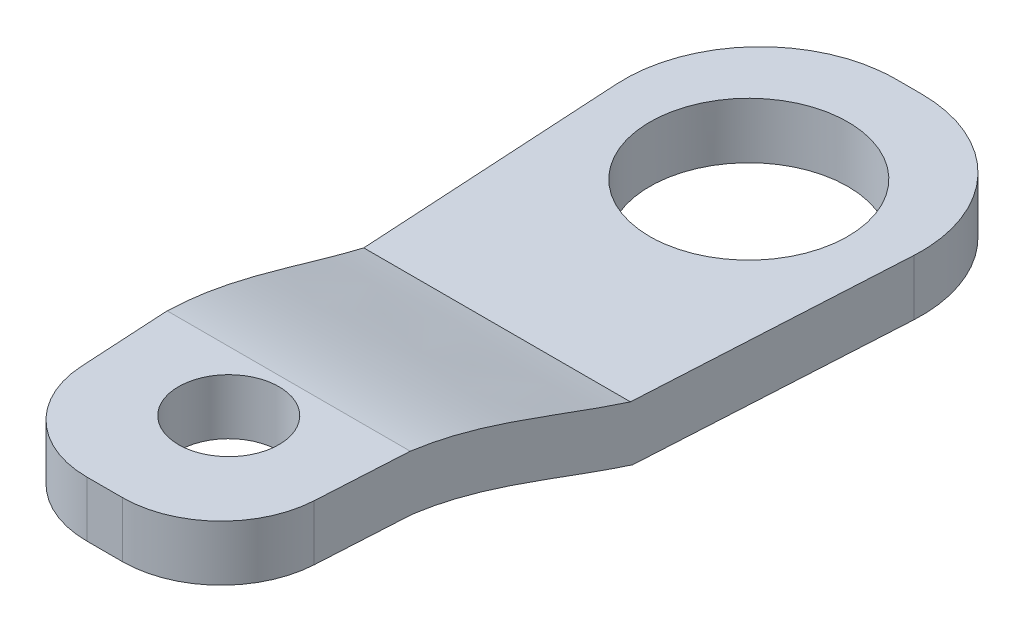
ISO-10303-21;
HEADER;
FILE_DESCRIPTION(('STEP AP214'),'2;1');
FILE_NAME('part.step','',(''),(''),'','','');
FILE_SCHEMA(('AUTOMOTIVE_DESIGN { 1 0 10303 214 1 1 1 1 }'));
ENDSEC;
DATA;
#1=APPLICATION_CONTEXT('core data for automotive mechanical design processes');
#2=APPLICATION_PROTOCOL_DEFINITION('international standard','automotive_design',2000,#1);
#3=PRODUCT_CONTEXT('',#1,'mechanical');
#4=PRODUCT('Part','Part','',(#3));
#5=PRODUCT_RELATED_PRODUCT_CATEGORY('part','',(#4));
#6=PRODUCT_DEFINITION_FORMATION('','',#4);
#7=PRODUCT_DEFINITION_CONTEXT('part definition',#1,'design');
#8=PRODUCT_DEFINITION('design','',#6,#7);
#9=PRODUCT_DEFINITION_SHAPE('','',#8);
#10=(LENGTH_UNIT() NAMED_UNIT(*) SI_UNIT(.MILLI.,.METRE.));
#11=(NAMED_UNIT(*) PLANE_ANGLE_UNIT() SI_UNIT($,.RADIAN.));
#12=(NAMED_UNIT(*) SI_UNIT($,.STERADIAN.) SOLID_ANGLE_UNIT());
#13=UNCERTAINTY_MEASURE_WITH_UNIT(LENGTH_MEASURE(1.E-05),#10,'distance_accuracy_value','');
#14=(GEOMETRIC_REPRESENTATION_CONTEXT(3) GLOBAL_UNCERTAINTY_ASSIGNED_CONTEXT((#13)) GLOBAL_UNIT_ASSIGNED_CONTEXT((#10,
#11,#12)) REPRESENTATION_CONTEXT('',''));
#15=CARTESIAN_POINT('',(0.,0.,0.));
#16=DIRECTION('',(0.,0.,1.));
#17=DIRECTION('',(1.,0.,0.));
#18=AXIS2_PLACEMENT_3D('',#15,#16,#17);
#19=CARTESIAN_POINT('',(-0.780669662808267,9.,-8.15169029207018));
#20=DIRECTION('',(0.,-1.,0.));
#21=DIRECTION('',(0.,0.,-1.));
#22=AXIS2_PLACEMENT_3D('',#19,#20,#21);
#23=CYLINDRICAL_SURFACE('',#22,8.);
#24=CARTESIAN_POINT('',(-0.780669662808267,8.99486053534029,-8.15169029207018));
#25=DIRECTION('',(0.,1.,0.));
#26=DIRECTION('',(0.,0.,1.));
#27=AXIS2_PLACEMENT_3D('',#24,#25,#26);
#28=CIRCLE('',#27,8.);
#29=CARTESIAN_POINT('',(-0.780669662808324,8.99486053534029,-0.151690292070181));
#30=VERTEX_POINT('',#29);
#31=CARTESIAN_POINT('',(7.20652224520296,8.99486053534029,-7.69918015450417));
#32=VERTEX_POINT('',#31);
#33=EDGE_CURVE('E147',#30,#32,#28,.T.);
#34=ORIENTED_EDGE('',*,*,#33,.F.);
#35=DIRECTION('',(0.,-1.,0.));
#36=VECTOR('',#35,1.);
#37=CARTESIAN_POINT('',(-0.780669662808324,9.,-0.151690292070182));
#38=LINE('',#37,#36);
#39=CARTESIAN_POINT('',(-0.780669662808324,4.5,-0.151690292070182));
#40=VERTEX_POINT('',#39);
#41=EDGE_CURVE('E61',#30,#40,#38,.T.);
#42=ORIENTED_EDGE('',*,*,#41,.T.);
#43=CARTESIAN_POINT('',(-0.780669662808267,4.5,-8.15169029207018));
#44=DIRECTION('',(0.,1.,0.));
#45=DIRECTION('',(0.,0.,1.));
#46=AXIS2_PLACEMENT_3D('',#43,#44,#45);
#47=CIRCLE('',#46,8.);
#48=CARTESIAN_POINT('',(7.20652224520296,4.5,-7.69918015450417));
#49=VERTEX_POINT('',#48);
#50=EDGE_CURVE('E229',#40,#49,#47,.T.);
#51=ORIENTED_EDGE('',*,*,#50,.T.);
#52=DIRECTION('',(0.,-1.,0.));
#53=VECTOR('',#52,1.);
#54=CARTESIAN_POINT('',(7.20652224520296,9.,-7.69918015450417));
#55=LINE('',#54,#53);
#56=EDGE_CURVE('E258',#32,#49,#55,.T.);
#57=ORIENTED_EDGE('',*,*,#56,.F.);
#58=EDGE_LOOP('',(#34,#42,#51,#57));
#59=FACE_BOUND('',#58,.T.);
#60=ADVANCED_FACE('F34',(#59),#23,.T.);
#61=CARTESIAN_POINT('',(-3.66148394776118,9.,-8.15169029207018));
#62=DIRECTION('',(0.,-1.,0.));
#63=DIRECTION('',(0.,0.,-1.));
#64=AXIS2_PLACEMENT_3D('',#61,#62,#63);
#65=CYLINDRICAL_SURFACE('',#64,8.);
#66=CARTESIAN_POINT('',(-3.66148394776118,8.99486053534029,-8.15169029207018));
#67=DIRECTION('',(0.,1.,0.));
#68=DIRECTION('',(0.,0.,1.));
#69=AXIS2_PLACEMENT_3D('',#66,#67,#68);
#70=CIRCLE('',#69,8.);
#71=CARTESIAN_POINT('',(-11.6486758557724,8.99486053534029,-7.69918015450416));
#72=VERTEX_POINT('',#71);
#73=CARTESIAN_POINT('',(-3.66148394776113,8.99486053534029,-0.151690292070181));
#74=VERTEX_POINT('',#73);
#75=EDGE_CURVE('E53',#72,#74,#70,.T.);
#76=ORIENTED_EDGE('',*,*,#75,.F.);
#77=DIRECTION('',(0.,-1.,0.));
#78=VECTOR('',#77,1.);
#79=CARTESIAN_POINT('',(-11.6486758557724,9.,-7.69918015450416));
#80=LINE('',#79,#78);
#81=CARTESIAN_POINT('',(-11.6486758557724,4.5,-7.69918015450416));
#82=VERTEX_POINT('',#81);
#83=EDGE_CURVE('E146',#72,#82,#80,.T.);
#84=ORIENTED_EDGE('',*,*,#83,.T.);
#85=CARTESIAN_POINT('',(-3.66148394776118,4.5,-8.15169029207018));
#86=DIRECTION('',(0.,1.,0.));
#87=DIRECTION('',(0.,0.,1.));
#88=AXIS2_PLACEMENT_3D('',#85,#86,#87);
#89=CIRCLE('',#88,8.);
#90=CARTESIAN_POINT('',(-3.66148394776113,4.5,-0.151690292070182));
#91=VERTEX_POINT('',#90);
#92=EDGE_CURVE('E262',#82,#91,#89,.T.);
#93=ORIENTED_EDGE('',*,*,#92,.T.);
#94=DIRECTION('',(0.,-1.,0.));
#95=VECTOR('',#94,1.);
#96=CARTESIAN_POINT('',(-3.66148394776113,9.,-0.151690292070181));
#97=LINE('',#96,#95);
#98=EDGE_CURVE('E247',#74,#91,#97,.T.);
#99=ORIENTED_EDGE('',*,*,#98,.F.);
#100=EDGE_LOOP('',(#76,#84,#93,#99));
#101=FACE_BOUND('',#100,.T.);
#102=ADVANCED_FACE('F290',(#101),#65,.T.);
#103=CARTESIAN_POINT('',(-2.22107680528473,9.,-0.151690292070181));
#104=DIRECTION('',(0.,0.,-1.));
#105=DIRECTION('',(-1.,0.,0.));
#106=AXIS2_PLACEMENT_3D('',#103,#104,#105);
#107=PLANE('',#106);
#108=DIRECTION('',(1.,0.,0.));
#109=VECTOR('',#108,1.);
#110=CARTESIAN_POINT('',(-2.22107680528473,8.99486053534029,-0.151690292070181));
#111=LINE('',#110,#109);
#112=EDGE_CURVE('E150',#74,#30,#111,.T.);
#113=ORIENTED_EDGE('',*,*,#112,.F.);
#114=ORIENTED_EDGE('',*,*,#98,.T.);
#115=DIRECTION('',(-1.,0.,0.));
#116=VECTOR('',#115,1.);
#117=CARTESIAN_POINT('',(80.,4.5,-0.151690292070182));
#118=LINE('',#117,#116);
#119=EDGE_CURVE('E270',#40,#91,#118,.T.);
#120=ORIENTED_EDGE('',*,*,#119,.F.);
#121=ORIENTED_EDGE('',*,*,#41,.F.);
#122=EDGE_LOOP('',(#113,#114,#120,#121));
#123=FACE_BOUND('',#122,.T.);
#124=ADVANCED_FACE('F287',(#123),#107,.F.);
#125=CARTESIAN_POINT('',(-2.22107680528473,9.,-10.2016864688228));
#126=DIRECTION('',(0.,-1.,0.));
#127=DIRECTION('',(0.,0.,-1.));
#128=AXIS2_PLACEMENT_3D('',#125,#126,#127);
#129=CYLINDRICAL_SURFACE('',#128,4.06906829041187);
#130=CARTESIAN_POINT('',(-2.22107680528473,4.5,-10.2016864688228));
#131=DIRECTION('',(0.,1.,0.));
#132=DIRECTION('',(0.,0.,1.));
#133=AXIS2_PLACEMENT_3D('',#130,#131,#132);
#134=CIRCLE('',#133,4.06906829041187);
#135=CARTESIAN_POINT('',(-2.22107680528473,4.5,-6.13261817841093));
#136=VERTEX_POINT('',#135);
#137=EDGE_CURVE('E260',#136,#136,#134,.T.);
#138=ORIENTED_EDGE('',*,*,#137,.F.);
#139=EDGE_LOOP('',(#138));
#140=FACE_BOUND('',#139,.T.);
#141=CARTESIAN_POINT('',(-2.22107680528473,8.99486053534029,-10.2016864688228));
#142=DIRECTION('',(0.,1.,0.));
#143=DIRECTION('',(0.,0.,1.));
#144=AXIS2_PLACEMENT_3D('',#141,#142,#143);
#145=CIRCLE('',#144,4.06906829041187);
#146=CARTESIAN_POINT('',(-2.22107680528473,8.99486053534029,-6.13261817841093));
#147=VERTEX_POINT('',#146);
#148=EDGE_CURVE('E197',#147,#147,#145,.T.);
#149=ORIENTED_EDGE('',*,*,#148,.T.);
#150=EDGE_LOOP('',(#149));
#151=FACE_BOUND('',#150,.T.);
#152=ADVANCED_FACE('F326',(#140,#151),#129,.F.);
#153=CARTESIAN_POINT('',(-0.780669662808267,0.,-8.15169029207018));
#154=DIRECTION('',(0.,1.,0.));
#155=DIRECTION('',(0.,0.,1.));
#156=AXIS2_PLACEMENT_3D('',#153,#154,#155);
#157=PLANE('',#156);
#158=CARTESIAN_POINT('',(-2.22107680528473,0.,-52.323354079952));
#159=DIRECTION('',(0.,1.,0.));
#160=DIRECTION('',(0.,0.,1.));
#161=AXIS2_PLACEMENT_3D('',#158,#159,#160);
#162=CIRCLE('',#161,8.02268496328231);
#163=CARTESIAN_POINT('',(-2.22107680528473,0.,-44.3006691166697));
#164=VERTEX_POINT('',#163);
#165=EDGE_CURVE('E220',#164,#164,#162,.T.);
#166=ORIENTED_EDGE('',*,*,#165,.T.);
#167=EDGE_LOOP('',(#166));
#168=FACE_BOUND('',#167,.T.);
#169=DIRECTION('',(0.0565637671957587,0.,-0.998398988501403));
#170=VECTOR('',#169,1.);
#171=CARTESIAN_POINT('',(9.81047351269663,0.,-53.6611526407986));
#172=LINE('',#171,#170);
#173=CARTESIAN_POINT('',(8.58959736948983,0.,-32.1116419399878));
#174=VERTEX_POINT('',#173);
#175=CARTESIAN_POINT('',(9.81047351269663,0.,-53.6611526407986));
#176=VERTEX_POINT('',#175);
#177=EDGE_CURVE('E222',#174,#176,#172,.T.);
#178=ORIENTED_EDGE('',*,*,#177,.F.);
#179=DIRECTION('',(-1.,0.,0.));
#180=VECTOR('',#179,1.);
#181=CARTESIAN_POINT('',(80.,0.,-32.1116419399878));
#182=LINE('',#181,#180);
#183=CARTESIAN_POINT('',(-13.0317509800593,0.,-32.1116419399878));
#184=VERTEX_POINT('',#183);
#185=EDGE_CURVE('E174',#174,#184,#182,.T.);
#186=ORIENTED_EDGE('',*,*,#185,.T.);
#187=DIRECTION('',(0.0565637671957587,0.,0.998398988501403));
#188=VECTOR('',#187,1.);
#189=CARTESIAN_POINT('',(-11.6486758557724,0.,-7.69918015450416));
#190=LINE('',#189,#188);
#191=CARTESIAN_POINT('',(-14.2526271232661,0.,-53.6611526407986));
#192=VERTEX_POINT('',#191);
#193=EDGE_CURVE('E244',#192,#184,#190,.T.);
#194=ORIENTED_EDGE('',*,*,#193,.F.);
#195=CARTESIAN_POINT('',(-3.27023824975065,0.,-54.283354079952));
#196=DIRECTION('',(0.,1.,0.));
#197=DIRECTION('',(0.,0.,1.));
#198=AXIS2_PLACEMENT_3D('',#195,#196,#197);
#199=CIRCLE('',#198,11.);
#200=CARTESIAN_POINT('',(-3.27023824975057,0.,-65.283354079952));
#201=VERTEX_POINT('',#200);
#202=EDGE_CURVE('E241',#201,#192,#199,.T.);
#203=ORIENTED_EDGE('',*,*,#202,.F.);
#204=DIRECTION('',(-1.,0.,0.));
#205=VECTOR('',#204,1.);
#206=CARTESIAN_POINT('',(-2.22107680528473,0.,-65.283354079952));
#207=LINE('',#206,#205);
#208=CARTESIAN_POINT('',(-1.17191536081888,0.,-65.283354079952));
#209=VERTEX_POINT('',#208);
#210=EDGE_CURVE('E238',#209,#201,#207,.T.);
#211=ORIENTED_EDGE('',*,*,#210,.F.);
#212=CARTESIAN_POINT('',(-1.1719153608188,0.,-54.283354079952));
#213=DIRECTION('',(0.,1.,0.));
#214=DIRECTION('',(0.,0.,-1.));
#215=AXIS2_PLACEMENT_3D('',#212,#213,#214);
#216=CIRCLE('',#215,11.);
#217=EDGE_CURVE('E226',#176,#209,#216,.T.);
#218=ORIENTED_EDGE('',*,*,#217,.F.);
#219=EDGE_LOOP('',(#178,#186,#194,#203,#211,#218));
#220=FACE_BOUND('',#219,.T.);
#221=ADVANCED_FACE('F295',(#168,#220),#157,.F.);
#222=CARTESIAN_POINT('',(9.81047351269663,9.,-53.6611526407986));
#223=DIRECTION('',(-0.998398988501403,0.,-0.0565637671957587));
#224=DIRECTION('',(-0.0565637671957587,0.,0.998398988501403));
#225=AXIS2_PLACEMENT_3D('',#222,#223,#224);
#226=PLANE('',#225);
#227=DIRECTION('',(0.,-1.,0.));
#228=VECTOR('',#227,1.);
#229=CARTESIAN_POINT('',(9.81047351269663,9.,-53.6611526407986));
#230=LINE('',#229,#228);
#231=CARTESIAN_POINT('',(9.81047351269663,4.52006155844422,-53.6611526407986));
#232=VERTEX_POINT('',#231);
#233=EDGE_CURVE('E256',#232,#176,#230,.T.);
#234=ORIENTED_EDGE('',*,*,#233,.F.);
#235=DIRECTION('',(-0.0565637292559566,-0.00115822595482634,0.998398318831365));
#236=VECTOR('',#235,1.);
#237=CARTESIAN_POINT('',(9.8107670094991,4.52006756822503,-53.6663331110048));
#238=LINE('',#237,#236);
#239=CARTESIAN_POINT('',(8.5797431514192,4.49486053534028,-31.9377065420833));
#240=VERTEX_POINT('',#239);
#241=EDGE_CURVE('E166',#232,#240,#238,.T.);
#242=ORIENTED_EDGE('',*,*,#241,.T.);
#243=CARTESIAN_POINT('',(8.5797431514192,4.49486053534028,-31.9377065420833));
#244=CARTESIAN_POINT('',(8.55914582804003,4.5970792493573,-31.5741461243969));
#245=CARTESIAN_POINT('',(8.53860465611112,4.70273620031739,-31.2115768279517));
#246=CARTESIAN_POINT('',(8.4976154109246,4.91939420509451,-30.488081506432));
#247=CARTESIAN_POINT('',(8.4771673257264,5.03039455106912,-30.127155270596));
#248=CARTESIAN_POINT('',(8.43632906249029,5.25629317982073,-29.4063249099523));
#249=CARTESIAN_POINT('',(8.41593891986661,5.37119344867318,-29.0464214102361));
#250=CARTESIAN_POINT('',(8.37520152584483,5.60339617018415,-28.3273714777102));
#251=CARTESIAN_POINT('',(8.3548542764915,5.72069873462851,-27.9682250809922));
#252=CARTESIAN_POINT('',(8.29385359984087,6.07399769397459,-26.8915108364279));
#253=CARTESIAN_POINT('',(8.25322761540412,6.31146283493225,-26.1744273785997));
#254=CARTESIAN_POINT('',(8.17186878695472,6.77905526179066,-24.7383742998077));
#255=CARTESIAN_POINT('',(8.13113603335511,7.00918738267715,-24.0194062747117));
#256=CARTESIAN_POINT('',(8.05223783504586,7.43536932076373,-22.6267854276256));
#257=CARTESIAN_POINT('',(8.01409454023009,7.63267847087418,-21.9535235702535));
#258=CARTESIAN_POINT('',(7.93742760401336,8.00167008405338,-20.6002864121737));
#259=CARTESIAN_POINT('',(7.89890416086955,8.17336522287887,-19.9203146108743));
#260=CARTESIAN_POINT('',(7.82119126055154,8.48179473238248,-18.5486152896024));
#261=CARTESIAN_POINT('',(7.78199941121125,8.61834667443748,-17.856845545847));
#262=CARTESIAN_POINT('',(7.72284906640709,8.78798884970072,-16.8127912448384));
#263=CARTESIAN_POINT('',(7.70305157922208,8.83870549613929,-16.4633486217547));
#264=CARTESIAN_POINT('',(7.66335650266666,8.92699148907899,-15.7626964861878));
#265=CARTESIAN_POINT('',(7.64345888087175,8.96455625623969,-15.4114864013843));
#266=CARTESIAN_POINT('',(7.62352199629893,8.99486053534029,-15.0595832948872));
#267=B_SPLINE_CURVE_WITH_KNOTS('',3,(#243,#244,#245,#246,#247,#248,#249,#250,#251,#252,#253,
#254,#255,#256,#257,#258,#259,#260,#261,#262,#263,#264,#265,#266),.UNSPECIFIED.,.F.,.F.,(4,2,2,
2,2,2,2,2,2,2,2,4),(0.,1.13460032678775,2.26905076385937,3.40408786512976,4.53917790354189,
6.80859872393722,9.07649087757242,11.1840030176922,13.2904687162311,15.4076580477269,
16.4684080106242,17.5295269485927),.UNSPECIFIED.);
#268=CARTESIAN_POINT('',(7.62352199629893,8.99486053534029,-15.0595832948872));
#269=VERTEX_POINT('',#268);
#270=EDGE_CURVE('E169',#240,#269,#267,.T.);
#271=ORIENTED_EDGE('',*,*,#270,.T.);
#272=DIRECTION('',(0.0565637671957587,0.,-0.998398988501403));
#273=VECTOR('',#272,1.);
#274=CARTESIAN_POINT('',(9.81047351269663,8.99486053534029,-53.6611526407986));
#275=LINE('',#274,#273);
#276=EDGE_CURVE('E141',#32,#269,#275,.T.);
#277=ORIENTED_EDGE('',*,*,#276,.F.);
#278=ORIENTED_EDGE('',*,*,#56,.T.);
#279=DIRECTION('',(0.0565637671957587,0.,-0.998398988501403));
#280=VECTOR('',#279,1.);
#281=CARTESIAN_POINT('',(9.81047351269663,4.5,-53.6611526407986));
#282=LINE('',#281,#280);
#283=CARTESIAN_POINT('',(7.63337621436956,4.5,-15.2335186927917));
#284=VERTEX_POINT('',#283);
#285=EDGE_CURVE('E279',#49,#284,#282,.T.);
#286=ORIENTED_EDGE('',*,*,#285,.T.);
#287=CARTESIAN_POINT('',(7.63337621436956,4.5,-15.2335186927917));
#288=CARTESIAN_POINT('',(7.65481178011339,4.46741998713298,-15.6118748069193));
#289=CARTESIAN_POINT('',(7.67620144314196,4.42644478542694,-15.9894206987656));
#290=CARTESIAN_POINT('',(7.71886237435082,4.3294067006668,-16.7424227118751));
#291=CARTESIAN_POINT('',(7.74013368896052,4.27335023351986,-17.1178796526569));
#292=CARTESIAN_POINT('',(7.80361099923428,4.08549115965417,-18.2383086041228));
#293=CARTESIAN_POINT('',(7.84562862571069,3.93375031413076,-18.9799557371375));
#294=CARTESIAN_POINT('',(7.92905377560243,3.59077761267957,-20.4524811610406));
#295=CARTESIAN_POINT('',(7.97046218389027,3.39961070283325,-21.1833750706874));
#296=CARTESIAN_POINT('',(8.05291242146074,2.9899238334399,-22.6386924562355));
#297=CARTESIAN_POINT('',(8.09395350415737,2.77135772992274,-23.3631027542536));
#298=CARTESIAN_POINT('',(8.17286844851725,2.33494634432919,-24.7560191834912));
#299=CARTESIAN_POINT('',(8.21076109700417,2.11814251204988,-25.4248569182562));
#300=CARTESIAN_POINT('',(8.28646895140348,1.68037546936244,-26.7611654599466));
#301=CARTESIAN_POINT('',(8.32428415622677,1.45941220089916,-27.4286362476486));
#302=CARTESIAN_POINT('',(8.3998564324967,1.02313584923814,-28.7625517191116));
#303=CARTESIAN_POINT('',(8.43761314999666,0.807804000470039,-29.42899015541));
#304=CARTESIAN_POINT('',(8.49443646733797,0.495239594533197,-30.4319704265174));
#305=CARTESIAN_POINT('',(8.51341043961417,0.392782740251991,-30.7668773053829));
#306=CARTESIAN_POINT('',(8.55143933137511,0.192562864053536,-31.4381198507486));
#307=CARTESIAN_POINT('',(8.5704942587001,0.0948003085897183,-31.774455655636));
#308=CARTESIAN_POINT('',(8.58959736948981,0.,-32.1116419399878));
#309=B_SPLINE_CURVE_WITH_KNOTS('',3,(#287,#288,#289,#290,#291,#292,#293,#294,#295,#296,#297,
#298,#299,#300,#301,#302,#303,#304,#305,#306,#307,#308),.UNSPECIFIED.,.F.,.F.,(4,2,2,2,2,2,2,2,
2,2,4),(0.,1.14085007601867,2.28121557430259,4.55406829795096,6.82320646241391,9.09621883997866,
11.2085359152778,13.3208824950448,15.4249420681175,16.47713663533,17.5294355394026),.UNSPECIFIED.);
#310=EDGE_CURVE('E223',#284,#174,#309,.T.);
#311=ORIENTED_EDGE('',*,*,#310,.T.);
#312=ORIENTED_EDGE('',*,*,#177,.T.);
#313=EDGE_LOOP('',(#234,#242,#271,#277,#278,#286,#311,#312));
#314=FACE_BOUND('',#313,.T.);
#315=ADVANCED_FACE('F179',(#314),#226,.F.);
#316=CARTESIAN_POINT('',(-1.1719153608188,9.,-54.283354079952));
#317=DIRECTION('',(0.,-1.,0.));
#318=DIRECTION('',(0.,0.,-1.));
#319=AXIS2_PLACEMENT_3D('',#316,#317,#318);
#320=CYLINDRICAL_SURFACE('',#319,11.);
#321=DIRECTION('',(0.,-1.,0.));
#322=VECTOR('',#321,1.);
#323=CARTESIAN_POINT('',(-1.17191536081888,9.,-65.283354079952));
#324=LINE('',#323,#322);
#325=CARTESIAN_POINT('',(-1.17191536081888,4.53354428883864,-65.283354079952));
#326=VERTEX_POINT('',#325);
#327=EDGE_CURVE('E254',#326,#209,#324,.T.);
#328=ORIENTED_EDGE('',*,*,#327,.F.);
#329=CARTESIAN_POINT('',(-1.1719153608188,4.52078336440319,-54.283354079952));
#330=DIRECTION('',(0.,-0.99999932710319,-0.00116008325896973));
#331=DIRECTION('',(0.,-0.00116008325896973,0.99999932710319));
#332=AXIS2_PLACEMENT_3D('',#329,#330,#331);
#333=ELLIPSE('',#332,11.0000074018699,11.);
#334=EDGE_CURVE('E163',#326,#232,#333,.T.);
#335=ORIENTED_EDGE('',*,*,#334,.T.);
#336=ORIENTED_EDGE('',*,*,#233,.T.);
#337=ORIENTED_EDGE('',*,*,#217,.T.);
#338=EDGE_LOOP('',(#328,#335,#336,#337));
#339=FACE_BOUND('',#338,.T.);
#340=ADVANCED_FACE('F309',(#339),#320,.T.);
#341=CARTESIAN_POINT('',(-2.22107680528473,9.,-65.283354079952));
#342=DIRECTION('',(0.,0.,1.));
#343=DIRECTION('',(1.,0.,0.));
#344=AXIS2_PLACEMENT_3D('',#341,#342,#343);
#345=PLANE('',#344);
#346=DIRECTION('',(0.,-1.,0.));
#347=VECTOR('',#346,1.);
#348=CARTESIAN_POINT('',(-3.27023824975057,9.,-65.283354079952));
#349=LINE('',#348,#347);
#350=CARTESIAN_POINT('',(-3.27023824975057,4.53354428883864,-65.283354079952));
#351=VERTEX_POINT('',#350);
#352=EDGE_CURVE('E252',#351,#201,#349,.T.);
#353=ORIENTED_EDGE('',*,*,#352,.F.);
#354=DIRECTION('',(1.,0.,0.));
#355=VECTOR('',#354,1.);
#356=CARTESIAN_POINT('',(-2.22107680528473,4.53354428883864,-65.283354079952));
#357=LINE('',#356,#355);
#358=EDGE_CURVE('E160',#351,#326,#357,.T.);
#359=ORIENTED_EDGE('',*,*,#358,.T.);
#360=ORIENTED_EDGE('',*,*,#327,.T.);
#361=ORIENTED_EDGE('',*,*,#210,.T.);
#362=EDGE_LOOP('',(#353,#359,#360,#361));
#363=FACE_BOUND('',#362,.T.);
#364=ADVANCED_FACE('F310',(#363),#345,.F.);
#365=CARTESIAN_POINT('',(-3.27023824975065,9.,-54.283354079952));
#366=DIRECTION('',(0.,-1.,0.));
#367=DIRECTION('',(0.,0.,-1.));
#368=AXIS2_PLACEMENT_3D('',#365,#366,#367);
#369=CYLINDRICAL_SURFACE('',#368,11.);
#370=CARTESIAN_POINT('',(-3.27023824975065,4.52078336440319,-54.283354079952));
#371=DIRECTION('',(0.,-0.99999932710319,-0.00116008325896973));
#372=DIRECTION('',(0.,-0.00116008325896973,0.99999932710319));
#373=AXIS2_PLACEMENT_3D('',#370,#371,#372);
#374=ELLIPSE('',#373,11.0000074018699,11.);
#375=CARTESIAN_POINT('',(-14.2526271232661,4.52006155844422,-53.6611526407986));
#376=VERTEX_POINT('',#375);
#377=EDGE_CURVE('E158',#376,#351,#374,.T.);
#378=ORIENTED_EDGE('',*,*,#377,.T.);
#379=ORIENTED_EDGE('',*,*,#352,.T.);
#380=ORIENTED_EDGE('',*,*,#202,.T.);
#381=DIRECTION('',(0.,-1.,0.));
#382=VECTOR('',#381,1.);
#383=CARTESIAN_POINT('',(-14.2526271232661,9.,-53.6611526407986));
#384=LINE('',#383,#382);
#385=EDGE_CURVE('E250',#376,#192,#384,.T.);
#386=ORIENTED_EDGE('',*,*,#385,.F.);
#387=EDGE_LOOP('',(#378,#379,#380,#386));
#388=FACE_BOUND('',#387,.T.);
#389=ADVANCED_FACE('F304',(#388),#369,.T.);
#390=CARTESIAN_POINT('',(-11.6486758557724,9.,-7.69918015450416));
#391=DIRECTION('',(0.998398988501403,0.,-0.0565637671957587));
#392=DIRECTION('',(-0.0565637671957587,0.,-0.998398988501403));
#393=AXIS2_PLACEMENT_3D('',#390,#391,#392);
#394=PLANE('',#393);
#395=CARTESIAN_POINT('',(-12.0656756068684,8.99486053534029,-15.0595832948872));
#396=CARTESIAN_POINT('',(-12.0871111726122,8.96228052247327,-15.4379394090147));
#397=CARTESIAN_POINT('',(-12.1085008356408,8.92130532076723,-15.815485300861));
#398=CARTESIAN_POINT('',(-12.1511617668497,8.82426723600709,-16.5684873139706));
#399=CARTESIAN_POINT('',(-12.1724330814594,8.76821076886015,-16.9439442547524));
#400=CARTESIAN_POINT('',(-12.2359103917331,8.58035169499446,-18.0643732062182));
#401=CARTESIAN_POINT('',(-12.2779280182095,8.42861084947105,-18.8060203392329));
#402=CARTESIAN_POINT('',(-12.3613531681012,8.08563814801985,-20.278545763136));
#403=CARTESIAN_POINT('',(-12.4027615763891,7.89447123817353,-21.0094396727828));
#404=CARTESIAN_POINT('',(-12.4852118139596,7.48478436878018,-22.4647570583309));
#405=CARTESIAN_POINT('',(-12.5262528966562,7.26621826526302,-23.189167356349));
#406=CARTESIAN_POINT('',(-12.6051678410161,6.82980687966946,-24.5820837855867));
#407=CARTESIAN_POINT('',(-12.643060489503,6.61300304739015,-25.2509215203516));
#408=CARTESIAN_POINT('',(-12.7187683439023,6.17523600470272,-26.5872300620421));
#409=CARTESIAN_POINT('',(-12.7565835487256,5.95427273623944,-27.254700849744));
#410=CARTESIAN_POINT('',(-12.8321558249955,5.51799638457842,-28.588616321207));
#411=CARTESIAN_POINT('',(-12.8699125424955,5.30266453581032,-29.2550547575054));
#412=CARTESIAN_POINT('',(-12.9267358598368,4.99010012987348,-30.2580350286128));
#413=CARTESIAN_POINT('',(-12.945709832113,4.88764327559227,-30.5929419074783));
#414=CARTESIAN_POINT('',(-12.9837387238739,4.68742339939382,-31.264184452844));
#415=CARTESIAN_POINT('',(-13.0027936511989,4.58966084393,-31.6005202577314));
#416=CARTESIAN_POINT('',(-13.0218967619887,4.49486053534028,-31.9377065420833));
#417=B_SPLINE_CURVE_WITH_KNOTS('',3,(#395,#396,#397,#398,#399,#400,#401,#402,#403,#404,#405,
#406,#407,#408,#409,#410,#411,#412,#413,#414,#415,#416),.UNSPECIFIED.,.F.,.F.,(4,2,2,2,2,2,2,2,
2,2,4),(0.,1.14085007601867,2.2812155743026,4.55406829795097,6.82320646241393,9.09621883997868,
11.2085359152778,13.3208824950448,15.4249420681175,16.47713663533,17.5294355394026),.UNSPECIFIED.);
#418=CARTESIAN_POINT('',(-12.0656756068684,8.99486053534029,-15.0595832948872));
#419=VERTEX_POINT('',#418);
#420=CARTESIAN_POINT('',(-13.0218967619887,4.49486053534028,-31.9377065420833));
#421=VERTEX_POINT('',#420);
#422=EDGE_CURVE('E11',#419,#421,#417,.T.);
#423=ORIENTED_EDGE('',*,*,#422,.T.);
#424=DIRECTION('',(-0.0565637292559566,0.00115822595482634,-0.998398318831365));
#425=VECTOR('',#424,1.);
#426=CARTESIAN_POINT('',(-11.6489728457426,4.46674788904353,-7.70442228211566));
#427=LINE('',#426,#425);
#428=EDGE_CURVE('E156',#421,#376,#427,.T.);
#429=ORIENTED_EDGE('',*,*,#428,.T.);
#430=ORIENTED_EDGE('',*,*,#385,.T.);
#431=ORIENTED_EDGE('',*,*,#193,.T.);
#432=CARTESIAN_POINT('',(-13.0317509800593,0.,-32.1116419399878));
#433=CARTESIAN_POINT('',(-13.0111536566801,0.102218714017027,-31.7480815223015));
#434=CARTESIAN_POINT('',(-12.9906124847512,0.20787566497712,-31.3855122258562));
#435=CARTESIAN_POINT('',(-12.9496232395647,0.424533669754245,-30.6620169043365));
#436=CARTESIAN_POINT('',(-12.9291751543665,0.535534015728858,-30.3010906685005));
#437=CARTESIAN_POINT('',(-12.8883368911304,0.76143264448047,-29.5802603078568));
#438=CARTESIAN_POINT('',(-12.8679467485067,0.876332913332921,-29.2203568081406));
#439=CARTESIAN_POINT('',(-12.8272093544849,1.1085356348439,-28.5013068756147));
#440=CARTESIAN_POINT('',(-12.8068621051316,1.22583819928825,-28.1421604788967));
#441=CARTESIAN_POINT('',(-12.7458614284809,1.57913715863433,-27.0654462343324));
#442=CARTESIAN_POINT('',(-12.7052354440442,1.81660229959199,-26.3483627765042));
#443=CARTESIAN_POINT('',(-12.6238766155948,2.2841947264504,-24.9123096977122));
#444=CARTESIAN_POINT('',(-12.5831438619952,2.51432684733688,-24.1933416726162));
#445=CARTESIAN_POINT('',(-12.5042456636859,2.94050878542346,-22.8007208255301));
#446=CARTESIAN_POINT('',(-12.4661023688701,3.13781793553392,-22.1274589681581));
#447=CARTESIAN_POINT('',(-12.3894354326534,3.5068095487131,-20.7742218100782));
#448=CARTESIAN_POINT('',(-12.3509119895096,3.67850468753859,-20.0942500087788));
#449=CARTESIAN_POINT('',(-12.2731990891916,3.98693419704219,-18.7225506875069));
#450=CARTESIAN_POINT('',(-12.2340072398513,4.1234861390972,-18.0307809437516));
#451=CARTESIAN_POINT('',(-12.1748568950472,4.29312831436044,-16.9867266427429));
#452=CARTESIAN_POINT('',(-12.1550594078622,4.34384496079901,-16.6372840196593));
#453=CARTESIAN_POINT('',(-12.1153643313067,4.43213095373871,-15.9366318840924));
#454=CARTESIAN_POINT('',(-12.0954667095118,4.46969572089941,-15.5854217992889));
#455=CARTESIAN_POINT('',(-12.075529824939,4.5,-15.2335186927917));
#456=B_SPLINE_CURVE_WITH_KNOTS('',3,(#432,#433,#434,#435,#436,#437,#438,#439,#440,#441,#442,
#443,#444,#445,#446,#447,#448,#449,#450,#451,#452,#453,#454,#455),.UNSPECIFIED.,.F.,.F.,(4,2,2,
2,2,2,2,2,2,2,2,4),(0.,1.13460032678775,2.26905076385937,3.40408786512976,4.53917790354189,
6.80859872393722,9.07649087757241,11.1840030176922,13.290468716231,15.4076580477269,
16.4684080106241,17.5295269485927),.UNSPECIFIED.);
#457=CARTESIAN_POINT('',(-12.075529824939,4.5,-15.2335186927917));
#458=VERTEX_POINT('',#457);
#459=EDGE_CURVE('E46',#184,#458,#456,.T.);
#460=ORIENTED_EDGE('',*,*,#459,.T.);
#461=DIRECTION('',(0.0565637671957587,0.,0.998398988501403));
#462=VECTOR('',#461,1.);
#463=CARTESIAN_POINT('',(-11.6486758557724,4.5,-7.69918015450416));
#464=LINE('',#463,#462);
#465=EDGE_CURVE('E267',#458,#82,#464,.T.);
#466=ORIENTED_EDGE('',*,*,#465,.T.);
#467=ORIENTED_EDGE('',*,*,#83,.F.);
#468=DIRECTION('',(0.0565637671957587,0.,0.998398988501403));
#469=VECTOR('',#468,1.);
#470=CARTESIAN_POINT('',(-11.6486758557724,8.99486053534029,-7.69918015450416));
#471=LINE('',#470,#469);
#472=EDGE_CURVE('E139',#419,#72,#471,.T.);
#473=ORIENTED_EDGE('',*,*,#472,.F.);
#474=EDGE_LOOP('',(#423,#429,#430,#431,#460,#466,#467,#473));
#475=FACE_BOUND('',#474,.T.);
#476=ADVANCED_FACE('F144',(#475),#394,.F.);
#477=CARTESIAN_POINT('',(-2.22107680528473,9.,-52.323354079952));
#478=DIRECTION('',(0.,-1.,0.));
#479=DIRECTION('',(0.,0.,-1.));
#480=AXIS2_PLACEMENT_3D('',#477,#478,#479);
#481=CYLINDRICAL_SURFACE('',#480,8.02268496328231);
#482=CARTESIAN_POINT('',(-2.22107680528473,4.5185095996856,-52.323354079952));
#483=DIRECTION('',(0.,-0.99999932710319,-0.00116008325896973));
#484=DIRECTION('',(0.,-0.00116008325896973,0.99999932710319));
#485=AXIS2_PLACEMENT_3D('',#482,#483,#484);
#486=ELLIPSE('',#485,8.02269036172506,8.02268496328231);
#487=CARTESIAN_POINT('',(-2.22107680528473,4.50920261090507,-44.3006691166697));
#488=VERTEX_POINT('',#487);
#489=EDGE_CURVE('E155',#488,#488,#486,.T.);
#490=ORIENTED_EDGE('',*,*,#489,.F.);
#491=EDGE_LOOP('',(#490));
#492=FACE_BOUND('',#491,.T.);
#493=ORIENTED_EDGE('',*,*,#165,.F.);
#494=EDGE_LOOP('',(#493));
#495=FACE_BOUND('',#494,.T.);
#496=ADVANCED_FACE('F213',(#492,#495),#481,.F.);
#497=CARTESIAN_POINT('',(80.,4.5,-15.2335186927917));
#498=CARTESIAN_POINT('',(80.,4.0034680681798,-20.9975774911831));
#499=CARTESIAN_POINT('',(80.,1.56773708115568,-26.5351687311767));
#500=CARTESIAN_POINT('',(80.,0.,-32.1116419399878));
#501=B_SPLINE_CURVE_WITH_KNOTS('',3,(#497,#498,#499,#500),.UNSPECIFIED.,.F.,.F.,(4,4),
(0.310739067612621,1.),.UNSPECIFIED.);
#502=DIRECTION('',(-1.,0.,0.));
#503=VECTOR('',#502,1.);
#504=SURFACE_OF_LINEAR_EXTRUSION('',#501,#503);
#505=DIRECTION('',(-1.,0.,0.));
#506=VECTOR('',#505,1.);
#507=CARTESIAN_POINT('',(80.,4.5,-15.2335186927917));
#508=LINE('',#507,#506);
#509=EDGE_CURVE('E263',#284,#458,#508,.T.);
#510=ORIENTED_EDGE('',*,*,#509,.T.);
#511=ORIENTED_EDGE('',*,*,#459,.F.);
#512=ORIENTED_EDGE('',*,*,#185,.F.);
#513=ORIENTED_EDGE('',*,*,#310,.F.);
#514=EDGE_LOOP('',(#510,#511,#512,#513));
#515=FACE_BOUND('',#514,.T.);
#516=ADVANCED_FACE('F216',(#515),#504,.F.);
#517=CARTESIAN_POINT('',(80.,4.5,0.));
#518=DIRECTION('',(0.,1.,0.));
#519=DIRECTION('',(0.,0.,1.));
#520=AXIS2_PLACEMENT_3D('',#517,#518,#519);
#521=PLANE('',#520);
#522=ORIENTED_EDGE('',*,*,#137,.T.);
#523=EDGE_LOOP('',(#522));
#524=FACE_BOUND('',#523,.T.);
#525=ORIENTED_EDGE('',*,*,#119,.T.);
#526=ORIENTED_EDGE('',*,*,#92,.F.);
#527=ORIENTED_EDGE('',*,*,#465,.F.);
#528=ORIENTED_EDGE('',*,*,#509,.F.);
#529=ORIENTED_EDGE('',*,*,#285,.F.);
#530=ORIENTED_EDGE('',*,*,#50,.F.);
#531=EDGE_LOOP('',(#525,#526,#527,#528,#529,#530));
#532=FACE_BOUND('',#531,.T.);
#533=ADVANCED_FACE('F187',(#524,#532),#521,.F.);
#534=CARTESIAN_POINT('',(-14.2702382497507,8.99486053534029,-15.0595832948872));
#535=CARTESIAN_POINT('',(-14.2702382497507,8.49832860352009,-20.8236420932785));
#536=CARTESIAN_POINT('',(-14.2702382497507,6.06259761649597,-26.3612333332721));
#537=CARTESIAN_POINT('',(-14.2702382497507,4.49486053534028,-31.9377065420833));
#538=B_SPLINE_CURVE_WITH_KNOTS('',3,(#534,#535,#536,#537),.UNSPECIFIED.,.F.,.F.,(4,4),
(0.310739067612621,1.),.UNSPECIFIED.);
#539=DIRECTION('',(1.,0.,0.));
#540=VECTOR('',#539,1.);
#541=SURFACE_OF_LINEAR_EXTRUSION('',#538,#540);
#542=DIRECTION('',(1.,0.,0.));
#543=VECTOR('',#542,1.);
#544=CARTESIAN_POINT('',(-14.2702382497507,4.49486053534028,-31.9377065420833));
#545=LINE('',#544,#543);
#546=EDGE_CURVE('E134',#421,#240,#545,.T.);
#547=ORIENTED_EDGE('',*,*,#546,.F.);
#548=ORIENTED_EDGE('',*,*,#422,.F.);
#549=DIRECTION('',(1.,0.,0.));
#550=VECTOR('',#549,1.);
#551=CARTESIAN_POINT('',(-14.2702382497507,8.99486053534029,-15.0595832948872));
#552=LINE('',#551,#550);
#553=EDGE_CURVE('E131',#419,#269,#552,.T.);
#554=ORIENTED_EDGE('',*,*,#553,.T.);
#555=ORIENTED_EDGE('',*,*,#270,.F.);
#556=EDGE_LOOP('',(#547,#548,#554,#555));
#557=FACE_BOUND('',#556,.T.);
#558=ADVANCED_FACE('F130',(#557),#541,.F.);
#559=CARTESIAN_POINT('',(-14.2702382497507,4.49486053534028,-31.9377065420832));
#560=DIRECTION('',(0.,-0.99999932710319,-0.00116008325896973));
#561=DIRECTION('',(0.,0.00116008325896973,-0.99999932710319));
#562=AXIS2_PLACEMENT_3D('',#559,#560,#561);
#563=PLANE('',#562);
#564=ORIENTED_EDGE('',*,*,#489,.T.);
#565=EDGE_LOOP('',(#564));
#566=FACE_BOUND('',#565,.T.);
#567=ORIENTED_EDGE('',*,*,#334,.F.);
#568=ORIENTED_EDGE('',*,*,#358,.F.);
#569=ORIENTED_EDGE('',*,*,#377,.F.);
#570=ORIENTED_EDGE('',*,*,#428,.F.);
#571=ORIENTED_EDGE('',*,*,#546,.T.);
#572=ORIENTED_EDGE('',*,*,#241,.F.);
#573=EDGE_LOOP('',(#567,#568,#569,#570,#571,#572));
#574=FACE_BOUND('',#573,.T.);
#575=ADVANCED_FACE('F186',(#566,#574),#563,.F.);
#576=CARTESIAN_POINT('',(-14.2702382497507,8.99486053534029,-15.0595832948872));
#577=DIRECTION('',(0.,1.,0.));
#578=DIRECTION('',(0.,0.,1.));
#579=AXIS2_PLACEMENT_3D('',#576,#577,#578);
#580=PLANE('',#579);
#581=ORIENTED_EDGE('',*,*,#148,.F.);
#582=EDGE_LOOP('',(#581));
#583=FACE_BOUND('',#582,.T.);
#584=ORIENTED_EDGE('',*,*,#276,.T.);
#585=ORIENTED_EDGE('',*,*,#553,.F.);
#586=ORIENTED_EDGE('',*,*,#472,.T.);
#587=ORIENTED_EDGE('',*,*,#75,.T.);
#588=ORIENTED_EDGE('',*,*,#112,.T.);
#589=ORIENTED_EDGE('',*,*,#33,.T.);
#590=EDGE_LOOP('',(#584,#585,#586,#587,#588,#589));
#591=FACE_BOUND('',#590,.T.);
#592=ADVANCED_FACE('F138',(#583,#591),#580,.T.);
#593=CLOSED_SHELL('',(#60,#102,#124,#152,#221,#315,#340,#364,#389,#476,#496,#516,#533,#558,#575,#592));
#594=MANIFOLD_SOLID_BREP('B2',#593);
#595=ADVANCED_BREP_SHAPE_REPRESENTATION('',(#18,#594),#14);
#596=SHAPE_DEFINITION_REPRESENTATION(#9,#595);
ENDSEC;
END-ISO-10303-21;
